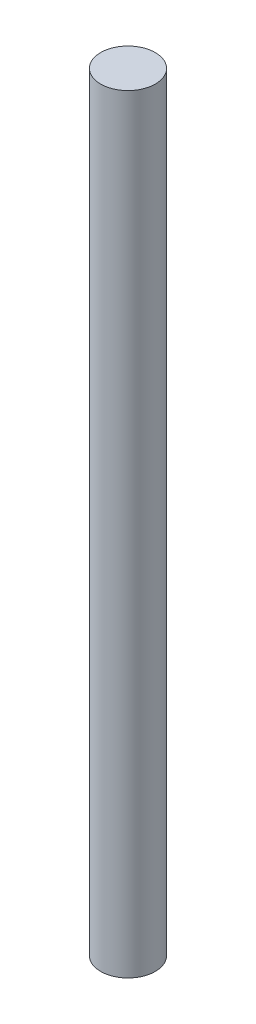
ISO-10303-21;
HEADER;
FILE_DESCRIPTION(('STEP AP214'),'2;1');
FILE_NAME('part.step','',(''),(''),'','','');
FILE_SCHEMA(('AUTOMOTIVE_DESIGN { 1 0 10303 214 1 1 1 1 }'));
ENDSEC;
DATA;
#1=APPLICATION_CONTEXT('core data for automotive mechanical design processes');
#2=APPLICATION_PROTOCOL_DEFINITION('international standard','automotive_design',2000,#1);
#3=PRODUCT_CONTEXT('',#1,'mechanical');
#4=PRODUCT('Part','Part','',(#3));
#5=PRODUCT_RELATED_PRODUCT_CATEGORY('part','',(#4));
#6=PRODUCT_DEFINITION_FORMATION('','',#4);
#7=PRODUCT_DEFINITION_CONTEXT('part definition',#1,'design');
#8=PRODUCT_DEFINITION('design','',#6,#7);
#9=PRODUCT_DEFINITION_SHAPE('','',#8);
#10=(LENGTH_UNIT() NAMED_UNIT(*) SI_UNIT(.MILLI.,.METRE.));
#11=(NAMED_UNIT(*) PLANE_ANGLE_UNIT() SI_UNIT($,.RADIAN.));
#12=(NAMED_UNIT(*) SI_UNIT($,.STERADIAN.) SOLID_ANGLE_UNIT());
#13=UNCERTAINTY_MEASURE_WITH_UNIT(LENGTH_MEASURE(1.E-05),#10,'distance_accuracy_value','');
#14=(GEOMETRIC_REPRESENTATION_CONTEXT(3) GLOBAL_UNCERTAINTY_ASSIGNED_CONTEXT((#13)) GLOBAL_UNIT_ASSIGNED_CONTEXT((#10,
#11,#12)) REPRESENTATION_CONTEXT('',''));
#15=CARTESIAN_POINT('',(0.,0.,0.));
#16=DIRECTION('',(0.,0.,1.));
#17=DIRECTION('',(1.,0.,0.));
#18=AXIS2_PLACEMENT_3D('',#15,#16,#17);
#19=CARTESIAN_POINT('',(0.,14.07,0.));
#20=DIRECTION('',(0.,-1.,0.));
#21=DIRECTION('',(0.,0.,-1.));
#22=AXIS2_PLACEMENT_3D('',#19,#20,#21);
#23=CYLINDRICAL_SURFACE('',#22,0.5);
#24=CARTESIAN_POINT('',(0.,14.07,0.));
#25=DIRECTION('',(0.,1.,0.));
#26=DIRECTION('',(0.,0.,1.));
#27=AXIS2_PLACEMENT_3D('',#24,#25,#26);
#28=CIRCLE('',#27,0.5);
#29=CARTESIAN_POINT('',(0.,14.07,0.5));
#30=VERTEX_POINT('',#29);
#31=EDGE_CURVE('E10',#30,#30,#28,.T.);
#32=ORIENTED_EDGE('',*,*,#31,.F.);
#33=EDGE_LOOP('',(#32));
#34=FACE_BOUND('',#33,.T.);
#35=CARTESIAN_POINT('',(0.,0.,0.));
#36=DIRECTION('',(0.,1.,0.));
#37=DIRECTION('',(0.,0.,1.));
#38=AXIS2_PLACEMENT_3D('',#35,#36,#37);
#39=CIRCLE('',#38,0.5);
#40=CARTESIAN_POINT('',(0.,0.,0.5));
#41=VERTEX_POINT('',#40);
#42=EDGE_CURVE('E35',#41,#41,#39,.T.);
#43=ORIENTED_EDGE('',*,*,#42,.T.);
#44=EDGE_LOOP('',(#43));
#45=FACE_BOUND('',#44,.T.);
#46=ADVANCED_FACE('F32',(#34,#45),#23,.T.);
#47=CARTESIAN_POINT('',(0.,14.07,0.));
#48=DIRECTION('',(0.,1.,0.));
#49=DIRECTION('',(0.,0.,1.));
#50=AXIS2_PLACEMENT_3D('',#47,#48,#49);
#51=PLANE('',#50);
#52=ORIENTED_EDGE('',*,*,#31,.T.);
#53=EDGE_LOOP('',(#52));
#54=FACE_BOUND('',#53,.T.);
#55=ADVANCED_FACE('F47',(#54),#51,.T.);
#56=CARTESIAN_POINT('',(0.,0.,0.));
#57=DIRECTION('',(0.,1.,0.));
#58=DIRECTION('',(0.,0.,1.));
#59=AXIS2_PLACEMENT_3D('',#56,#57,#58);
#60=PLANE('',#59);
#61=ORIENTED_EDGE('',*,*,#42,.F.);
#62=EDGE_LOOP('',(#61));
#63=FACE_BOUND('',#62,.T.);
#64=ADVANCED_FACE('F45',(#63),#60,.F.);
#65=CLOSED_SHELL('',(#46,#55,#64));
#66=MANIFOLD_SOLID_BREP('B2',#65);
#67=ADVANCED_BREP_SHAPE_REPRESENTATION('',(#18,#66),#14);
#68=SHAPE_DEFINITION_REPRESENTATION(#9,#67);
ENDSEC;
END-ISO-10303-21;
